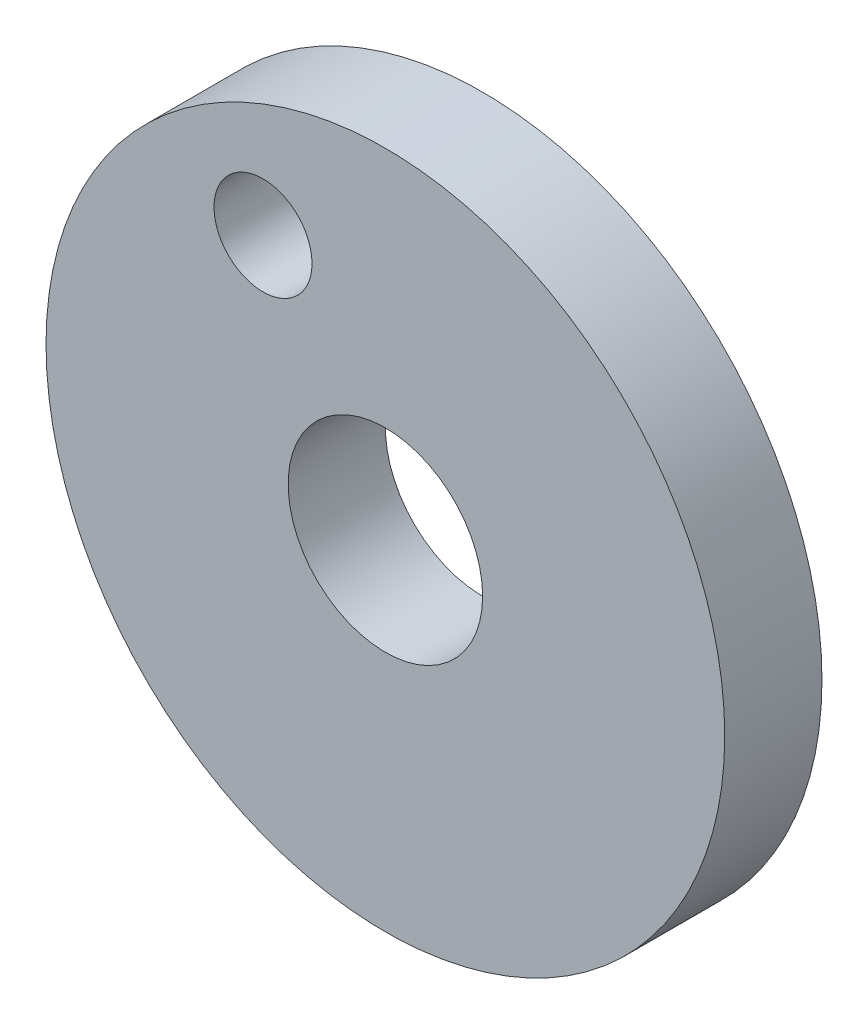
ISO-10303-21;
HEADER;
FILE_DESCRIPTION(('STEP AP214'),'2;1');
FILE_NAME('part.step','',(''),(''),'','','');
FILE_SCHEMA(('AUTOMOTIVE_DESIGN { 1 0 10303 214 1 1 1 1 }'));
ENDSEC;
DATA;
#1=APPLICATION_CONTEXT('core data for automotive mechanical design processes');
#2=APPLICATION_PROTOCOL_DEFINITION('international standard','automotive_design',2000,#1);
#3=PRODUCT_CONTEXT('',#1,'mechanical');
#4=PRODUCT('Part','Part','',(#3));
#5=PRODUCT_RELATED_PRODUCT_CATEGORY('part','',(#4));
#6=PRODUCT_DEFINITION_FORMATION('','',#4);
#7=PRODUCT_DEFINITION_CONTEXT('part definition',#1,'design');
#8=PRODUCT_DEFINITION('design','',#6,#7);
#9=PRODUCT_DEFINITION_SHAPE('','',#8);
#10=(LENGTH_UNIT() NAMED_UNIT(*) SI_UNIT(.MILLI.,.METRE.));
#11=(NAMED_UNIT(*) PLANE_ANGLE_UNIT() SI_UNIT($,.RADIAN.));
#12=(NAMED_UNIT(*) SI_UNIT($,.STERADIAN.) SOLID_ANGLE_UNIT());
#13=UNCERTAINTY_MEASURE_WITH_UNIT(LENGTH_MEASURE(1.E-05),#10,'distance_accuracy_value','');
#14=(GEOMETRIC_REPRESENTATION_CONTEXT(3) GLOBAL_UNCERTAINTY_ASSIGNED_CONTEXT((#13)) GLOBAL_UNIT_ASSIGNED_CONTEXT((#10,
#11,#12)) REPRESENTATION_CONTEXT('',''));
#15=CARTESIAN_POINT('',(0.,0.,0.));
#16=DIRECTION('',(0.,0.,1.));
#17=DIRECTION('',(1.,0.,0.));
#18=AXIS2_PLACEMENT_3D('',#15,#16,#17);
#19=CARTESIAN_POINT('',(0.,0.,10.));
#20=DIRECTION('',(0.,0.,1.));
#21=DIRECTION('',(1.,0.,0.));
#22=AXIS2_PLACEMENT_3D('',#19,#20,#21);
#23=PLANE('',#22);
#24=CARTESIAN_POINT('',(0.,0.,10.));
#25=DIRECTION('',(0.,0.,1.));
#26=DIRECTION('',(1.,0.,0.));
#27=AXIS2_PLACEMENT_3D('',#24,#25,#26);
#28=CIRCLE('',#27,10.);
#29=CARTESIAN_POINT('',(10.,0.,10.));
#30=VERTEX_POINT('',#29);
#31=EDGE_CURVE('E42',#30,#30,#28,.T.);
#32=ORIENTED_EDGE('',*,*,#31,.F.);
#33=EDGE_LOOP('',(#32));
#34=FACE_BOUND('',#33,.T.);
#35=CARTESIAN_POINT('',(0.,0.,10.));
#36=DIRECTION('',(0.,0.,1.));
#37=DIRECTION('',(1.,0.,0.));
#38=AXIS2_PLACEMENT_3D('',#35,#36,#37);
#39=CIRCLE('',#38,34.9);
#40=CARTESIAN_POINT('',(34.9,0.,10.));
#41=VERTEX_POINT('',#40);
#42=EDGE_CURVE('E10',#41,#41,#39,.T.);
#43=ORIENTED_EDGE('',*,*,#42,.T.);
#44=EDGE_LOOP('',(#43));
#45=FACE_BOUND('',#44,.T.);
#46=CARTESIAN_POINT('',(-12.5847383157992,20.8494522237302,10.));
#47=DIRECTION('',(0.,0.,1.));
#48=DIRECTION('',(1.,0.,0.));
#49=AXIS2_PLACEMENT_3D('',#46,#47,#48);
#50=CIRCLE('',#49,5.0399552015529);
#51=CARTESIAN_POINT('',(-7.54478311424628,20.8494522237302,10.));
#52=VERTEX_POINT('',#51);
#53=EDGE_CURVE('E47',#52,#52,#50,.T.);
#54=ORIENTED_EDGE('',*,*,#53,.F.);
#55=EDGE_LOOP('',(#54));
#56=FACE_BOUND('',#55,.T.);
#57=ADVANCED_FACE('F31',(#34,#45,#56),#23,.T.);
#58=CARTESIAN_POINT('',(0.,0.,0.));
#59=DIRECTION('',(0.,0.,1.));
#60=DIRECTION('',(1.,0.,0.));
#61=AXIS2_PLACEMENT_3D('',#58,#59,#60);
#62=PLANE('',#61);
#63=CARTESIAN_POINT('',(0.,0.,0.));
#64=DIRECTION('',(0.,0.,1.));
#65=DIRECTION('',(1.,0.,0.));
#66=AXIS2_PLACEMENT_3D('',#63,#64,#65);
#67=CIRCLE('',#66,34.9);
#68=CARTESIAN_POINT('',(34.9,0.,0.));
#69=VERTEX_POINT('',#68);
#70=EDGE_CURVE('E35',#69,#69,#67,.T.);
#71=ORIENTED_EDGE('',*,*,#70,.F.);
#72=EDGE_LOOP('',(#71));
#73=FACE_BOUND('',#72,.T.);
#74=CARTESIAN_POINT('',(0.,0.,0.));
#75=DIRECTION('',(0.,0.,1.));
#76=DIRECTION('',(1.,0.,0.));
#77=AXIS2_PLACEMENT_3D('',#74,#75,#76);
#78=CIRCLE('',#77,10.);
#79=CARTESIAN_POINT('',(10.,0.,0.));
#80=VERTEX_POINT('',#79);
#81=EDGE_CURVE('E44',#80,#80,#78,.T.);
#82=ORIENTED_EDGE('',*,*,#81,.T.);
#83=EDGE_LOOP('',(#82));
#84=FACE_BOUND('',#83,.T.);
#85=CARTESIAN_POINT('',(-12.5847383157992,20.8494522237302,0.));
#86=DIRECTION('',(0.,0.,1.));
#87=DIRECTION('',(1.,0.,0.));
#88=AXIS2_PLACEMENT_3D('',#85,#86,#87);
#89=CIRCLE('',#88,5.0399552015529);
#90=CARTESIAN_POINT('',(-7.54478311424628,20.8494522237302,0.));
#91=VERTEX_POINT('',#90);
#92=EDGE_CURVE('E50',#91,#91,#89,.T.);
#93=ORIENTED_EDGE('',*,*,#92,.T.);
#94=EDGE_LOOP('',(#93));
#95=FACE_BOUND('',#94,.T.);
#96=ADVANCED_FACE('F60',(#73,#84,#95),#62,.F.);
#97=CARTESIAN_POINT('',(0.,0.,10.));
#98=DIRECTION('',(0.,0.,-1.));
#99=DIRECTION('',(-1.,0.,0.));
#100=AXIS2_PLACEMENT_3D('',#97,#98,#99);
#101=CYLINDRICAL_SURFACE('',#100,34.9);
#102=ORIENTED_EDGE('',*,*,#42,.F.);
#103=EDGE_LOOP('',(#102));
#104=FACE_BOUND('',#103,.T.);
#105=ORIENTED_EDGE('',*,*,#70,.T.);
#106=EDGE_LOOP('',(#105));
#107=FACE_BOUND('',#106,.T.);
#108=ADVANCED_FACE('F33',(#104,#107),#101,.T.);
#109=CARTESIAN_POINT('',(0.,0.,10.));
#110=DIRECTION('',(0.,0.,-1.));
#111=DIRECTION('',(-1.,0.,0.));
#112=AXIS2_PLACEMENT_3D('',#109,#110,#111);
#113=CYLINDRICAL_SURFACE('',#112,10.);
#114=ORIENTED_EDGE('',*,*,#31,.T.);
#115=EDGE_LOOP('',(#114));
#116=FACE_BOUND('',#115,.T.);
#117=ORIENTED_EDGE('',*,*,#81,.F.);
#118=EDGE_LOOP('',(#117));
#119=FACE_BOUND('',#118,.T.);
#120=ADVANCED_FACE('F69',(#116,#119),#113,.F.);
#121=CARTESIAN_POINT('',(-12.5847383157992,20.8494522237302,10.));
#122=DIRECTION('',(0.,0.,-1.));
#123=DIRECTION('',(-1.,0.,0.));
#124=AXIS2_PLACEMENT_3D('',#121,#122,#123);
#125=CYLINDRICAL_SURFACE('',#124,5.0399552015529);
#126=ORIENTED_EDGE('',*,*,#53,.T.);
#127=EDGE_LOOP('',(#126));
#128=FACE_BOUND('',#127,.T.);
#129=ORIENTED_EDGE('',*,*,#92,.F.);
#130=EDGE_LOOP('',(#129));
#131=FACE_BOUND('',#130,.T.);
#132=ADVANCED_FACE('F56',(#128,#131),#125,.F.);
#133=CLOSED_SHELL('',(#57,#96,#108,#120,#132));
#134=MANIFOLD_SOLID_BREP('B2',#133);
#135=ADVANCED_BREP_SHAPE_REPRESENTATION('',(#18,#134),#14);
#136=SHAPE_DEFINITION_REPRESENTATION(#9,#135);
ENDSEC;
END-ISO-10303-21;
